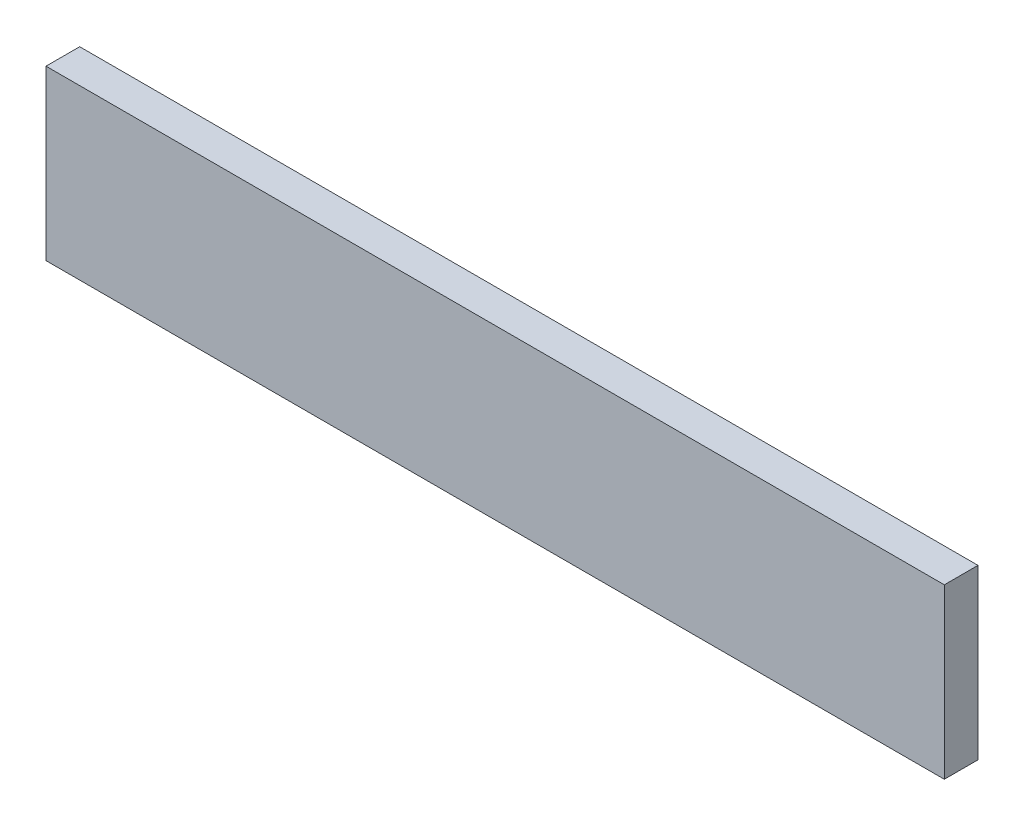
ISO-10303-21;
HEADER;
FILE_DESCRIPTION(('STEP AP214'),'2;1');
FILE_NAME('part.step','',(''),(''),'','','');
FILE_SCHEMA(('AUTOMOTIVE_DESIGN { 1 0 10303 214 1 1 1 1 }'));
ENDSEC;
DATA;
#1=APPLICATION_CONTEXT('core data for automotive mechanical design processes');
#2=APPLICATION_PROTOCOL_DEFINITION('international standard','automotive_design',2000,#1);
#3=PRODUCT_CONTEXT('',#1,'mechanical');
#4=PRODUCT('Part','Part','',(#3));
#5=PRODUCT_RELATED_PRODUCT_CATEGORY('part','',(#4));
#6=PRODUCT_DEFINITION_FORMATION('','',#4);
#7=PRODUCT_DEFINITION_CONTEXT('part definition',#1,'design');
#8=PRODUCT_DEFINITION('design','',#6,#7);
#9=PRODUCT_DEFINITION_SHAPE('','',#8);
#10=(LENGTH_UNIT() NAMED_UNIT(*) SI_UNIT(.MILLI.,.METRE.));
#11=(NAMED_UNIT(*) PLANE_ANGLE_UNIT() SI_UNIT($,.RADIAN.));
#12=(NAMED_UNIT(*) SI_UNIT($,.STERADIAN.) SOLID_ANGLE_UNIT());
#13=UNCERTAINTY_MEASURE_WITH_UNIT(LENGTH_MEASURE(1.E-05),#10,'distance_accuracy_value','');
#14=(GEOMETRIC_REPRESENTATION_CONTEXT(3) GLOBAL_UNCERTAINTY_ASSIGNED_CONTEXT((#13)) GLOBAL_UNIT_ASSIGNED_CONTEXT((#10,
#11,#12)) REPRESENTATION_CONTEXT('',''));
#15=CARTESIAN_POINT('',(0.,0.,0.));
#16=DIRECTION('',(0.,0.,1.));
#17=DIRECTION('',(1.,0.,0.));
#18=AXIS2_PLACEMENT_3D('',#15,#16,#17);
#19=CARTESIAN_POINT('',(40.,-7.5,3.));
#20=DIRECTION('',(-1.,0.,0.));
#21=DIRECTION('',(0.,0.,1.));
#22=AXIS2_PLACEMENT_3D('',#19,#20,#21);
#23=PLANE('',#22);
#24=DIRECTION('',(0.,1.,0.));
#25=VECTOR('',#24,1.);
#26=CARTESIAN_POINT('',(40.,-7.5,0.));
#27=LINE('',#26,#25);
#28=CARTESIAN_POINT('',(40.,-7.5,0.));
#29=VERTEX_POINT('',#28);
#30=CARTESIAN_POINT('',(40.,7.5,0.));
#31=VERTEX_POINT('',#30);
#32=EDGE_CURVE('E107',#29,#31,#27,.T.);
#33=ORIENTED_EDGE('',*,*,#32,.T.);
#34=DIRECTION('',(0.,0.,-1.));
#35=VECTOR('',#34,1.);
#36=CARTESIAN_POINT('',(40.,7.5,3.));
#37=LINE('',#36,#35);
#38=CARTESIAN_POINT('',(40.,7.5,3.));
#39=VERTEX_POINT('',#38);
#40=EDGE_CURVE('E11',#39,#31,#37,.T.);
#41=ORIENTED_EDGE('',*,*,#40,.F.);
#42=DIRECTION('',(0.,1.,0.));
#43=VECTOR('',#42,1.);
#44=CARTESIAN_POINT('',(40.,-7.5,3.));
#45=LINE('',#44,#43);
#46=CARTESIAN_POINT('',(40.,-7.5,3.));
#47=VERTEX_POINT('',#46);
#48=EDGE_CURVE('E91',#47,#39,#45,.T.);
#49=ORIENTED_EDGE('',*,*,#48,.F.);
#50=DIRECTION('',(0.,0.,-1.));
#51=VECTOR('',#50,1.);
#52=CARTESIAN_POINT('',(40.,-7.5,3.));
#53=LINE('',#52,#51);
#54=EDGE_CURVE('E103',#47,#29,#53,.T.);
#55=ORIENTED_EDGE('',*,*,#54,.T.);
#56=EDGE_LOOP('',(#33,#41,#49,#55));
#57=FACE_BOUND('',#56,.T.);
#58=ADVANCED_FACE('F39',(#57),#23,.F.);
#59=CARTESIAN_POINT('',(-40.,7.5,3.));
#60=DIRECTION('',(0.,-1.,0.));
#61=DIRECTION('',(0.,0.,-1.));
#62=AXIS2_PLACEMENT_3D('',#59,#60,#61);
#63=PLANE('',#62);
#64=DIRECTION('',(-1.,0.,0.));
#65=VECTOR('',#64,1.);
#66=CARTESIAN_POINT('',(-40.,7.5,0.));
#67=LINE('',#66,#65);
#68=CARTESIAN_POINT('',(-40.,7.5,0.));
#69=VERTEX_POINT('',#68);
#70=EDGE_CURVE('E96',#31,#69,#67,.T.);
#71=ORIENTED_EDGE('',*,*,#70,.T.);
#72=DIRECTION('',(0.,0.,-1.));
#73=VECTOR('',#72,1.);
#74=CARTESIAN_POINT('',(-40.,7.5,3.));
#75=LINE('',#74,#73);
#76=CARTESIAN_POINT('',(-40.,7.5,3.));
#77=VERTEX_POINT('',#76);
#78=EDGE_CURVE('E48',#77,#69,#75,.T.);
#79=ORIENTED_EDGE('',*,*,#78,.F.);
#80=DIRECTION('',(-1.,0.,0.));
#81=VECTOR('',#80,1.);
#82=CARTESIAN_POINT('',(-40.,7.5,3.));
#83=LINE('',#82,#81);
#84=EDGE_CURVE('E86',#39,#77,#83,.T.);
#85=ORIENTED_EDGE('',*,*,#84,.F.);
#86=ORIENTED_EDGE('',*,*,#40,.T.);
#87=EDGE_LOOP('',(#71,#79,#85,#86));
#88=FACE_BOUND('',#87,.T.);
#89=ADVANCED_FACE('F95',(#88),#63,.F.);
#90=CARTESIAN_POINT('',(-40.,-7.5,3.));
#91=DIRECTION('',(1.,0.,0.));
#92=DIRECTION('',(0.,0.,-1.));
#93=AXIS2_PLACEMENT_3D('',#90,#91,#92);
#94=PLANE('',#93);
#95=DIRECTION('',(0.,-1.,0.));
#96=VECTOR('',#95,1.);
#97=CARTESIAN_POINT('',(-40.,-7.5,0.));
#98=LINE('',#97,#96);
#99=CARTESIAN_POINT('',(-40.,-7.5,0.));
#100=VERTEX_POINT('',#99);
#101=EDGE_CURVE('E73',#69,#100,#98,.T.);
#102=ORIENTED_EDGE('',*,*,#101,.T.);
#103=DIRECTION('',(0.,0.,-1.));
#104=VECTOR('',#103,1.);
#105=CARTESIAN_POINT('',(-40.,-7.5,3.));
#106=LINE('',#105,#104);
#107=CARTESIAN_POINT('',(-40.,-7.5,3.));
#108=VERTEX_POINT('',#107);
#109=EDGE_CURVE('E98',#108,#100,#106,.T.);
#110=ORIENTED_EDGE('',*,*,#109,.F.);
#111=DIRECTION('',(0.,-1.,0.));
#112=VECTOR('',#111,1.);
#113=CARTESIAN_POINT('',(-40.,-7.5,3.));
#114=LINE('',#113,#112);
#115=EDGE_CURVE('E89',#77,#108,#114,.T.);
#116=ORIENTED_EDGE('',*,*,#115,.F.);
#117=ORIENTED_EDGE('',*,*,#78,.T.);
#118=EDGE_LOOP('',(#102,#110,#116,#117));
#119=FACE_BOUND('',#118,.T.);
#120=ADVANCED_FACE('F99',(#119),#94,.F.);
#121=CARTESIAN_POINT('',(-40.,-7.5,3.));
#122=DIRECTION('',(0.,1.,0.));
#123=DIRECTION('',(0.,0.,1.));
#124=AXIS2_PLACEMENT_3D('',#121,#122,#123);
#125=PLANE('',#124);
#126=DIRECTION('',(1.,0.,0.));
#127=VECTOR('',#126,1.);
#128=CARTESIAN_POINT('',(-40.,-7.5,0.));
#129=LINE('',#128,#127);
#130=EDGE_CURVE('E79',#100,#29,#129,.T.);
#131=ORIENTED_EDGE('',*,*,#130,.T.);
#132=ORIENTED_EDGE('',*,*,#54,.F.);
#133=DIRECTION('',(1.,0.,0.));
#134=VECTOR('',#133,1.);
#135=CARTESIAN_POINT('',(-40.,-7.5,3.));
#136=LINE('',#135,#134);
#137=EDGE_CURVE('E56',#108,#47,#136,.T.);
#138=ORIENTED_EDGE('',*,*,#137,.F.);
#139=ORIENTED_EDGE('',*,*,#109,.T.);
#140=EDGE_LOOP('',(#131,#132,#138,#139));
#141=FACE_BOUND('',#140,.T.);
#142=ADVANCED_FACE('F120',(#141),#125,.F.);
#143=CARTESIAN_POINT('',(0.,0.,3.));
#144=DIRECTION('',(0.,0.,-1.));
#145=DIRECTION('',(-1.,0.,0.));
#146=AXIS2_PLACEMENT_3D('',#143,#144,#145);
#147=PLANE('',#146);
#148=ORIENTED_EDGE('',*,*,#48,.T.);
#149=ORIENTED_EDGE('',*,*,#84,.T.);
#150=ORIENTED_EDGE('',*,*,#115,.T.);
#151=ORIENTED_EDGE('',*,*,#137,.T.);
#152=EDGE_LOOP('',(#148,#149,#150,#151));
#153=FACE_BOUND('',#152,.T.);
#154=ADVANCED_FACE('F87',(#153),#147,.F.);
#155=CARTESIAN_POINT('',(0.,0.,0.));
#156=DIRECTION('',(0.,0.,-1.));
#157=DIRECTION('',(-1.,0.,0.));
#158=AXIS2_PLACEMENT_3D('',#155,#156,#157);
#159=PLANE('',#158);
#160=ORIENTED_EDGE('',*,*,#32,.F.);
#161=ORIENTED_EDGE('',*,*,#130,.F.);
#162=ORIENTED_EDGE('',*,*,#101,.F.);
#163=ORIENTED_EDGE('',*,*,#70,.F.);
#164=EDGE_LOOP('',(#160,#161,#162,#163));
#165=FACE_BOUND('',#164,.T.);
#166=ADVANCED_FACE('F123',(#165),#159,.T.);
#167=CLOSED_SHELL('',(#58,#89,#120,#142,#154,#166));
#168=MANIFOLD_SOLID_BREP('B2',#167);
#169=ADVANCED_BREP_SHAPE_REPRESENTATION('',(#18,#168),#14);
#170=SHAPE_DEFINITION_REPRESENTATION(#9,#169);
ENDSEC;
END-ISO-10303-21;
